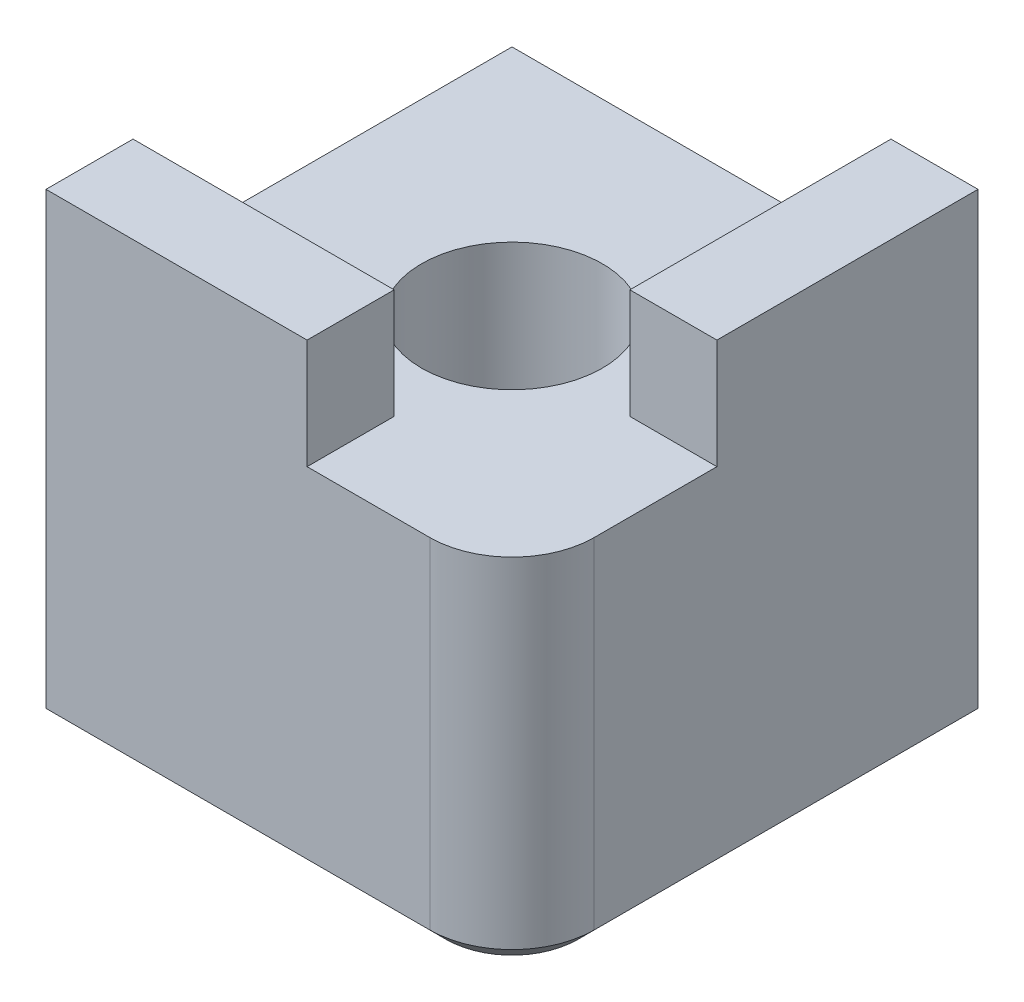
ISO-10303-21;
HEADER;
FILE_DESCRIPTION(('STEP AP214'),'2;1');
FILE_NAME('part.step','',(''),(''),'','','');
FILE_SCHEMA(('AUTOMOTIVE_DESIGN { 1 0 10303 214 1 1 1 1 }'));
ENDSEC;
DATA;
#1=APPLICATION_CONTEXT('core data for automotive mechanical design processes');
#2=APPLICATION_PROTOCOL_DEFINITION('international standard','automotive_design',2000,#1);
#3=PRODUCT_CONTEXT('',#1,'mechanical');
#4=PRODUCT('Part','Part','',(#3));
#5=PRODUCT_RELATED_PRODUCT_CATEGORY('part','',(#4));
#6=PRODUCT_DEFINITION_FORMATION('','',#4);
#7=PRODUCT_DEFINITION_CONTEXT('part definition',#1,'design');
#8=PRODUCT_DEFINITION('design','',#6,#7);
#9=PRODUCT_DEFINITION_SHAPE('','',#8);
#10=(LENGTH_UNIT() NAMED_UNIT(*) SI_UNIT(.MILLI.,.METRE.));
#11=(NAMED_UNIT(*) PLANE_ANGLE_UNIT() SI_UNIT($,.RADIAN.));
#12=(NAMED_UNIT(*) SI_UNIT($,.STERADIAN.) SOLID_ANGLE_UNIT());
#13=UNCERTAINTY_MEASURE_WITH_UNIT(LENGTH_MEASURE(1.E-05),#10,'distance_accuracy_value','');
#14=(GEOMETRIC_REPRESENTATION_CONTEXT(3) GLOBAL_UNCERTAINTY_ASSIGNED_CONTEXT((#13)) GLOBAL_UNIT_ASSIGNED_CONTEXT((#10,
#11,#12)) REPRESENTATION_CONTEXT('',''));
#15=CARTESIAN_POINT('',(0.,0.,0.));
#16=DIRECTION('',(0.,0.,1.));
#17=DIRECTION('',(1.,0.,0.));
#18=AXIS2_PLACEMENT_3D('',#15,#16,#17);
#19=CARTESIAN_POINT('',(0.,-1.5,0.));
#20=DIRECTION('',(0.,1.,0.));
#21=DIRECTION('',(0.,0.,1.));
#22=AXIS2_PLACEMENT_3D('',#19,#20,#21);
#23=PLANE('',#22);
#24=CARTESIAN_POINT('',(0.,-1.5,0.));
#25=DIRECTION('',(0.,1.,0.));
#26=DIRECTION('',(0.,0.,1.));
#27=AXIS2_PLACEMENT_3D('',#24,#25,#26);
#28=CIRCLE('',#27,1.65);
#29=CARTESIAN_POINT('',(0.,-1.5,1.65));
#30=VERTEX_POINT('',#29);
#31=EDGE_CURVE('E252',#30,#30,#28,.T.);
#32=ORIENTED_EDGE('',*,*,#31,.F.);
#33=EDGE_LOOP('',(#32));
#34=FACE_BOUND('',#33,.T.);
#35=DIRECTION('',(-1.,0.,0.));
#36=VECTOR('',#35,1.);
#37=CARTESIAN_POINT('',(-4.25,-1.5,2.6625));
#38=LINE('',#37,#36);
#39=CARTESIAN_POINT('',(0.512500000000001,-1.5,2.6625));
#40=VERTEX_POINT('',#39);
#41=CARTESIAN_POINT('',(-4.25,-1.5,2.6625));
#42=VERTEX_POINT('',#41);
#43=EDGE_CURVE('E197',#40,#42,#38,.T.);
#44=ORIENTED_EDGE('',*,*,#43,.F.);
#45=DIRECTION('',(0.,0.,-1.));
#46=VECTOR('',#45,1.);
#47=CARTESIAN_POINT('',(0.512500000000001,-1.5,4.25));
#48=LINE('',#47,#46);
#49=CARTESIAN_POINT('',(0.512500000000001,-1.5,4.25));
#50=VERTEX_POINT('',#49);
#51=EDGE_CURVE('E202',#50,#40,#48,.T.);
#52=ORIENTED_EDGE('',*,*,#51,.F.);
#53=DIRECTION('',(1.,0.,0.));
#54=VECTOR('',#53,1.);
#55=CARTESIAN_POINT('',(-4.25,-1.5,4.25));
#56=LINE('',#55,#54);
#57=CARTESIAN_POINT('',(2.75,-1.5,4.25));
#58=VERTEX_POINT('',#57);
#59=EDGE_CURVE('E260',#50,#58,#56,.T.);
#60=ORIENTED_EDGE('',*,*,#59,.T.);
#61=CARTESIAN_POINT('',(2.75,-1.5,2.75));
#62=DIRECTION('',(0.,1.,0.));
#63=DIRECTION('',(0.,0.,1.));
#64=AXIS2_PLACEMENT_3D('',#61,#62,#63);
#65=CIRCLE('',#64,1.5);
#66=CARTESIAN_POINT('',(4.25,-1.5,2.75));
#67=VERTEX_POINT('',#66);
#68=EDGE_CURVE('E247',#67,#58,#65,.F.);
#69=ORIENTED_EDGE('',*,*,#68,.F.);
#70=DIRECTION('',(0.,0.,1.));
#71=VECTOR('',#70,1.);
#72=CARTESIAN_POINT('',(4.25,-1.5,-4.25));
#73=LINE('',#72,#71);
#74=CARTESIAN_POINT('',(4.25,-1.5,0.512500000000001));
#75=VERTEX_POINT('',#74);
#76=EDGE_CURVE('E263',#75,#67,#73,.T.);
#77=ORIENTED_EDGE('',*,*,#76,.F.);
#78=DIRECTION('',(1.,0.,0.));
#79=VECTOR('',#78,1.);
#80=CARTESIAN_POINT('',(4.25,-1.5,0.512500000000001));
#81=LINE('',#80,#79);
#82=CARTESIAN_POINT('',(2.6625,-1.5,0.512500000000001));
#83=VERTEX_POINT('',#82);
#84=EDGE_CURVE('E222',#83,#75,#81,.T.);
#85=ORIENTED_EDGE('',*,*,#84,.F.);
#86=DIRECTION('',(0.,0.,1.));
#87=VECTOR('',#86,1.);
#88=CARTESIAN_POINT('',(2.6625,-1.5,-4.25));
#89=LINE('',#88,#87);
#90=CARTESIAN_POINT('',(2.6625,-1.5,-4.25));
#91=VERTEX_POINT('',#90);
#92=EDGE_CURVE('E73',#91,#83,#89,.T.);
#93=ORIENTED_EDGE('',*,*,#92,.F.);
#94=DIRECTION('',(-1.,0.,0.));
#95=VECTOR('',#94,1.);
#96=CARTESIAN_POINT('',(-4.25,-1.5,-4.25));
#97=LINE('',#96,#95);
#98=CARTESIAN_POINT('',(-4.25,-1.5,-4.25));
#99=VERTEX_POINT('',#98);
#100=EDGE_CURVE('E270',#91,#99,#97,.T.);
#101=ORIENTED_EDGE('',*,*,#100,.T.);
#102=DIRECTION('',(0.,0.,1.));
#103=VECTOR('',#102,1.);
#104=CARTESIAN_POINT('',(-4.25,-1.5,-4.25));
#105=LINE('',#104,#103);
#106=EDGE_CURVE('E266',#99,#42,#105,.T.);
#107=ORIENTED_EDGE('',*,*,#106,.T.);
#108=EDGE_LOOP('',(#44,#52,#60,#69,#77,#85,#93,#101,#107));
#109=FACE_BOUND('',#108,.T.);
#110=ADVANCED_FACE('F42',(#34,#109),#23,.T.);
#111=CARTESIAN_POINT('',(-4.25,-8.,4.25));
#112=DIRECTION('',(0.,0.,1.));
#113=DIRECTION('',(1.,0.,0.));
#114=AXIS2_PLACEMENT_3D('',#111,#112,#113);
#115=PLANE('',#114);
#116=DIRECTION('',(0.,1.,0.));
#117=VECTOR('',#116,1.);
#118=CARTESIAN_POINT('',(2.75,-8.,4.25));
#119=LINE('',#118,#117);
#120=CARTESIAN_POINT('',(2.75,-7.7,4.25));
#121=VERTEX_POINT('',#120);
#122=EDGE_CURVE('E179',#121,#58,#119,.T.);
#123=ORIENTED_EDGE('',*,*,#122,.T.);
#124=ORIENTED_EDGE('',*,*,#59,.F.);
#125=DIRECTION('',(0.,-1.,0.));
#126=VECTOR('',#125,1.);
#127=CARTESIAN_POINT('',(0.512500000000001,0.5,4.25));
#128=LINE('',#127,#126);
#129=CARTESIAN_POINT('',(0.512500000000001,0.5,4.25));
#130=VERTEX_POINT('',#129);
#131=EDGE_CURVE('E187',#130,#50,#128,.T.);
#132=ORIENTED_EDGE('',*,*,#131,.F.);
#133=DIRECTION('',(1.,0.,0.));
#134=VECTOR('',#133,1.);
#135=CARTESIAN_POINT('',(-4.25,0.5,4.25));
#136=LINE('',#135,#134);
#137=CARTESIAN_POINT('',(-4.25,0.5,4.25));
#138=VERTEX_POINT('',#137);
#139=EDGE_CURVE('E183',#138,#130,#136,.T.);
#140=ORIENTED_EDGE('',*,*,#139,.F.);
#141=DIRECTION('',(0.,1.,0.));
#142=VECTOR('',#141,1.);
#143=CARTESIAN_POINT('',(-4.25,-8.,4.25));
#144=LINE('',#143,#142);
#145=CARTESIAN_POINT('',(-4.25,-7.7,4.25));
#146=VERTEX_POINT('',#145);
#147=EDGE_CURVE('E168',#146,#138,#144,.T.);
#148=ORIENTED_EDGE('',*,*,#147,.F.);
#149=DIRECTION('',(1.,0.,0.));
#150=VECTOR('',#149,1.);
#151=CARTESIAN_POINT('',(-4.25,-7.7,4.25));
#152=LINE('',#151,#150);
#153=EDGE_CURVE('E302',#146,#121,#152,.T.);
#154=ORIENTED_EDGE('',*,*,#153,.T.);
#155=EDGE_LOOP('',(#123,#124,#132,#140,#148,#154));
#156=FACE_BOUND('',#155,.T.);
#157=ADVANCED_FACE('F185',(#156),#115,.T.);
#158=CARTESIAN_POINT('',(4.25,-8.,4.25));
#159=DIRECTION('',(1.,0.,0.));
#160=DIRECTION('',(0.,0.,-1.));
#161=AXIS2_PLACEMENT_3D('',#158,#159,#160);
#162=PLANE('',#161);
#163=DIRECTION('',(0.,1.,0.));
#164=VECTOR('',#163,1.);
#165=CARTESIAN_POINT('',(4.25,-8.,-4.25));
#166=LINE('',#165,#164);
#167=CARTESIAN_POINT('',(4.25,-7.7,-4.25));
#168=VERTEX_POINT('',#167);
#169=CARTESIAN_POINT('',(4.25,0.5,-4.25));
#170=VERTEX_POINT('',#169);
#171=EDGE_CURVE('E272',#168,#170,#166,.T.);
#172=ORIENTED_EDGE('',*,*,#171,.T.);
#173=DIRECTION('',(0.,0.,-1.));
#174=VECTOR('',#173,1.);
#175=CARTESIAN_POINT('',(4.25,0.5,-4.25));
#176=LINE('',#175,#174);
#177=CARTESIAN_POINT('',(4.25,0.5,0.512500000000001));
#178=VERTEX_POINT('',#177);
#179=EDGE_CURVE('E217',#178,#170,#176,.T.);
#180=ORIENTED_EDGE('',*,*,#179,.F.);
#181=DIRECTION('',(0.,-1.,0.));
#182=VECTOR('',#181,1.);
#183=CARTESIAN_POINT('',(4.25,0.5,0.512500000000001));
#184=LINE('',#183,#182);
#185=EDGE_CURVE('E231',#178,#75,#184,.T.);
#186=ORIENTED_EDGE('',*,*,#185,.T.);
#187=ORIENTED_EDGE('',*,*,#76,.T.);
#188=DIRECTION('',(0.,1.,0.));
#189=VECTOR('',#188,1.);
#190=CARTESIAN_POINT('',(4.25,-8.,2.75));
#191=LINE('',#190,#189);
#192=CARTESIAN_POINT('',(4.25,-7.7,2.75));
#193=VERTEX_POINT('',#192);
#194=EDGE_CURVE('E281',#67,#193,#191,.F.);
#195=ORIENTED_EDGE('',*,*,#194,.T.);
#196=DIRECTION('',(0.,0.,-1.));
#197=VECTOR('',#196,1.);
#198=CARTESIAN_POINT('',(4.25,-7.7,4.25));
#199=LINE('',#198,#197);
#200=EDGE_CURVE('E52',#193,#168,#199,.T.);
#201=ORIENTED_EDGE('',*,*,#200,.T.);
#202=EDGE_LOOP('',(#172,#180,#186,#187,#195,#201));
#203=FACE_BOUND('',#202,.T.);
#204=ADVANCED_FACE('F338',(#203),#162,.T.);
#205=CARTESIAN_POINT('',(2.75,-8.,2.75));
#206=DIRECTION('',(0.,1.,0.));
#207=DIRECTION('',(0.,0.,1.));
#208=AXIS2_PLACEMENT_3D('',#205,#206,#207);
#209=CYLINDRICAL_SURFACE('',#208,1.5);
#210=ORIENTED_EDGE('',*,*,#194,.F.);
#211=ORIENTED_EDGE('',*,*,#68,.T.);
#212=ORIENTED_EDGE('',*,*,#122,.F.);
#213=CARTESIAN_POINT('',(2.75,-7.7,2.75));
#214=DIRECTION('',(0.,-1.,0.));
#215=DIRECTION('',(0.,0.,-1.));
#216=AXIS2_PLACEMENT_3D('',#213,#214,#215);
#217=CIRCLE('',#216,1.5);
#218=EDGE_CURVE('E305',#121,#193,#217,.F.);
#219=ORIENTED_EDGE('',*,*,#218,.T.);
#220=EDGE_LOOP('',(#210,#211,#212,#219));
#221=FACE_BOUND('',#220,.T.);
#222=ADVANCED_FACE('F385',(#221),#209,.T.);
#223=CARTESIAN_POINT('',(-4.25,-8.,4.25));
#224=DIRECTION('',(-1.,0.,0.));
#225=DIRECTION('',(0.,0.,1.));
#226=AXIS2_PLACEMENT_3D('',#223,#224,#225);
#227=PLANE('',#226);
#228=DIRECTION('',(0.,1.,0.));
#229=VECTOR('',#228,1.);
#230=CARTESIAN_POINT('',(-4.25,-8.,-4.25));
#231=LINE('',#230,#229);
#232=CARTESIAN_POINT('',(-4.25,-7.7,-4.25));
#233=VERTEX_POINT('',#232);
#234=EDGE_CURVE('E180',#233,#99,#231,.T.);
#235=ORIENTED_EDGE('',*,*,#234,.F.);
#236=DIRECTION('',(0.,0.,1.));
#237=VECTOR('',#236,1.);
#238=CARTESIAN_POINT('',(-4.25,-7.7,4.25));
#239=LINE('',#238,#237);
#240=EDGE_CURVE('E176',#233,#146,#239,.T.);
#241=ORIENTED_EDGE('',*,*,#240,.T.);
#242=ORIENTED_EDGE('',*,*,#147,.T.);
#243=DIRECTION('',(0.,0.,1.));
#244=VECTOR('',#243,1.);
#245=CARTESIAN_POINT('',(-4.25,0.5,4.25));
#246=LINE('',#245,#244);
#247=CARTESIAN_POINT('',(-4.25,0.5,2.6625));
#248=VERTEX_POINT('',#247);
#249=EDGE_CURVE('E174',#248,#138,#246,.T.);
#250=ORIENTED_EDGE('',*,*,#249,.F.);
#251=DIRECTION('',(0.,-1.,0.));
#252=VECTOR('',#251,1.);
#253=CARTESIAN_POINT('',(-4.25,0.5,2.6625));
#254=LINE('',#253,#252);
#255=EDGE_CURVE('E208',#248,#42,#254,.T.);
#256=ORIENTED_EDGE('',*,*,#255,.T.);
#257=ORIENTED_EDGE('',*,*,#106,.F.);
#258=EDGE_LOOP('',(#235,#241,#242,#250,#256,#257));
#259=FACE_BOUND('',#258,.T.);
#260=ADVANCED_FACE('F171',(#259),#227,.T.);
#261=CARTESIAN_POINT('',(-4.25,-8.,-4.25));
#262=DIRECTION('',(0.,0.,-1.));
#263=DIRECTION('',(-1.,0.,0.));
#264=AXIS2_PLACEMENT_3D('',#261,#262,#263);
#265=PLANE('',#264);
#266=ORIENTED_EDGE('',*,*,#171,.F.);
#267=DIRECTION('',(-1.,0.,0.));
#268=VECTOR('',#267,1.);
#269=CARTESIAN_POINT('',(-4.25,-7.7,-4.25));
#270=LINE('',#269,#268);
#271=EDGE_CURVE('E11',#168,#233,#270,.T.);
#272=ORIENTED_EDGE('',*,*,#271,.T.);
#273=ORIENTED_EDGE('',*,*,#234,.T.);
#274=ORIENTED_EDGE('',*,*,#100,.F.);
#275=DIRECTION('',(0.,-1.,0.));
#276=VECTOR('',#275,1.);
#277=CARTESIAN_POINT('',(2.6625,0.5,-4.25));
#278=LINE('',#277,#276);
#279=CARTESIAN_POINT('',(2.6625,0.5,-4.25));
#280=VERTEX_POINT('',#279);
#281=EDGE_CURVE('E244',#280,#91,#278,.T.);
#282=ORIENTED_EDGE('',*,*,#281,.F.);
#283=DIRECTION('',(-1.,0.,0.));
#284=VECTOR('',#283,1.);
#285=CARTESIAN_POINT('',(4.25,0.5,-4.25));
#286=LINE('',#285,#284);
#287=EDGE_CURVE('E221',#170,#280,#286,.T.);
#288=ORIENTED_EDGE('',*,*,#287,.F.);
#289=EDGE_LOOP('',(#266,#272,#273,#274,#282,#288));
#290=FACE_BOUND('',#289,.T.);
#291=ADVANCED_FACE('F343',(#290),#265,.T.);
#292=CARTESIAN_POINT('',(0.,-8.,0.));
#293=DIRECTION('',(0.,-1.,0.));
#294=DIRECTION('',(0.,0.,-1.));
#295=AXIS2_PLACEMENT_3D('',#292,#293,#294);
#296=PLANE('',#295);
#297=DIRECTION('',(-1.,0.,0.));
#298=VECTOR('',#297,1.);
#299=CARTESIAN_POINT('',(0.,-8.,3.95));
#300=LINE('',#299,#298);
#301=CARTESIAN_POINT('',(2.75,-8.,3.95));
#302=VERTEX_POINT('',#301);
#303=CARTESIAN_POINT('',(-3.95,-8.,3.95));
#304=VERTEX_POINT('',#303);
#305=EDGE_CURVE('E295',#302,#304,#300,.T.);
#306=ORIENTED_EDGE('',*,*,#305,.T.);
#307=DIRECTION('',(0.,0.,-1.));
#308=VECTOR('',#307,1.);
#309=CARTESIAN_POINT('',(-3.95,-8.,0.));
#310=LINE('',#309,#308);
#311=CARTESIAN_POINT('',(-3.95,-8.,-3.95));
#312=VERTEX_POINT('',#311);
#313=EDGE_CURVE('E298',#304,#312,#310,.T.);
#314=ORIENTED_EDGE('',*,*,#313,.T.);
#315=DIRECTION('',(1.,0.,0.));
#316=VECTOR('',#315,1.);
#317=CARTESIAN_POINT('',(0.,-8.,-3.95));
#318=LINE('',#317,#316);
#319=CARTESIAN_POINT('',(3.95,-8.,-3.95));
#320=VERTEX_POINT('',#319);
#321=EDGE_CURVE('E286',#312,#320,#318,.T.);
#322=ORIENTED_EDGE('',*,*,#321,.T.);
#323=DIRECTION('',(0.,0.,1.));
#324=VECTOR('',#323,1.);
#325=CARTESIAN_POINT('',(3.95,-8.,0.));
#326=LINE('',#325,#324);
#327=CARTESIAN_POINT('',(3.95,-8.,2.75));
#328=VERTEX_POINT('',#327);
#329=EDGE_CURVE('E289',#320,#328,#326,.T.);
#330=ORIENTED_EDGE('',*,*,#329,.T.);
#331=CARTESIAN_POINT('',(2.75,-8.,2.75));
#332=DIRECTION('',(0.,-1.,0.));
#333=DIRECTION('',(0.,0.,-1.));
#334=AXIS2_PLACEMENT_3D('',#331,#332,#333);
#335=CIRCLE('',#334,1.2);
#336=EDGE_CURVE('E292',#328,#302,#335,.T.);
#337=ORIENTED_EDGE('',*,*,#336,.T.);
#338=EDGE_LOOP('',(#306,#314,#322,#330,#337));
#339=FACE_BOUND('',#338,.T.);
#340=CARTESIAN_POINT('',(0.,-8.,0.));
#341=DIRECTION('',(0.,1.,0.));
#342=DIRECTION('',(0.,0.,1.));
#343=AXIS2_PLACEMENT_3D('',#340,#341,#342);
#344=CIRCLE('',#343,1.65);
#345=CARTESIAN_POINT('',(0.,-8.,1.65));
#346=VERTEX_POINT('',#345);
#347=EDGE_CURVE('E256',#346,#346,#344,.T.);
#348=ORIENTED_EDGE('',*,*,#347,.T.);
#349=EDGE_LOOP('',(#348));
#350=FACE_BOUND('',#349,.T.);
#351=ADVANCED_FACE('F379',(#339,#350),#296,.T.);
#352=CARTESIAN_POINT('',(0.,-1.5,0.));
#353=DIRECTION('',(0.,1.,0.));
#354=DIRECTION('',(0.,0.,1.));
#355=AXIS2_PLACEMENT_3D('',#352,#353,#354);
#356=CYLINDRICAL_SURFACE('',#355,1.65);
#357=ORIENTED_EDGE('',*,*,#347,.F.);
#358=EDGE_LOOP('',(#357));
#359=FACE_BOUND('',#358,.T.);
#360=ORIENTED_EDGE('',*,*,#31,.T.);
#361=EDGE_LOOP('',(#360));
#362=FACE_BOUND('',#361,.T.);
#363=ADVANCED_FACE('F378',(#359,#362),#356,.F.);
#364=CARTESIAN_POINT('',(4.25,-7.7,4.25));
#365=DIRECTION('',(-0.707106781186543,0.707106781186552,0.));
#366=DIRECTION('',(0.,0.,-1.));
#367=AXIS2_PLACEMENT_3D('',#364,#365,#366);
#368=PLANE('',#367);
#369=DIRECTION('',(-0.577350269189628,-0.577350269189622,0.577350269189628));
#370=VECTOR('',#369,1.);
#371=CARTESIAN_POINT('',(1.41666666666664,-10.5333333333333,-1.41666666666665));
#372=LINE('',#371,#370);
#373=EDGE_CURVE('E319',#168,#320,#372,.T.);
#374=ORIENTED_EDGE('',*,*,#373,.F.);
#375=ORIENTED_EDGE('',*,*,#200,.F.);
#376=DIRECTION('',(0.707106781186552,0.707106781186543,0.));
#377=VECTOR('',#376,1.);
#378=CARTESIAN_POINT('',(3.95,-8.,2.75));
#379=LINE('',#378,#377);
#380=EDGE_CURVE('E46',#328,#193,#379,.T.);
#381=ORIENTED_EDGE('',*,*,#380,.F.);
#382=ORIENTED_EDGE('',*,*,#329,.F.);
#383=EDGE_LOOP('',(#374,#375,#381,#382));
#384=FACE_BOUND('',#383,.T.);
#385=ADVANCED_FACE('F44',(#384),#368,.F.);
#386=CARTESIAN_POINT('',(2.75,-8.,2.75));
#387=DIRECTION('',(0.,1.,0.));
#388=DIRECTION('',(0.,0.,1.));
#389=AXIS2_PLACEMENT_3D('',#386,#387,#388);
#390=CONICAL_SURFACE('',#389,1.2,0.785398163397455);
#391=ORIENTED_EDGE('',*,*,#380,.T.);
#392=ORIENTED_EDGE('',*,*,#218,.F.);
#393=DIRECTION('',(0.,0.707106781186543,0.707106781186552));
#394=VECTOR('',#393,1.);
#395=CARTESIAN_POINT('',(2.75,-8.,3.95));
#396=LINE('',#395,#394);
#397=EDGE_CURVE('E316',#302,#121,#396,.T.);
#398=ORIENTED_EDGE('',*,*,#397,.F.);
#399=ORIENTED_EDGE('',*,*,#336,.F.);
#400=EDGE_LOOP('',(#391,#392,#398,#399));
#401=FACE_BOUND('',#400,.T.);
#402=ADVANCED_FACE('F331',(#401),#390,.T.);
#403=CARTESIAN_POINT('',(-4.25,-7.7,-4.25));
#404=DIRECTION('',(0.,0.707106781186552,0.707106781186543));
#405=DIRECTION('',(-1.,0.,0.));
#406=AXIS2_PLACEMENT_3D('',#403,#404,#405);
#407=PLANE('',#406);
#408=ORIENTED_EDGE('',*,*,#373,.T.);
#409=ORIENTED_EDGE('',*,*,#321,.F.);
#410=DIRECTION('',(-0.577350269189628,0.577350269189622,-0.577350269189628));
#411=VECTOR('',#410,1.);
#412=CARTESIAN_POINT('',(-4.25,-7.7,-4.25));
#413=LINE('',#412,#411);
#414=EDGE_CURVE('E313',#233,#312,#413,.F.);
#415=ORIENTED_EDGE('',*,*,#414,.F.);
#416=ORIENTED_EDGE('',*,*,#271,.F.);
#417=EDGE_LOOP('',(#408,#409,#415,#416));
#418=FACE_BOUND('',#417,.T.);
#419=ADVANCED_FACE('F395',(#418),#407,.F.);
#420=CARTESIAN_POINT('',(-4.25,-7.7,4.25));
#421=DIRECTION('',(0.,0.707106781186552,-0.707106781186543));
#422=DIRECTION('',(1.,0.,0.));
#423=AXIS2_PLACEMENT_3D('',#420,#421,#422);
#424=PLANE('',#423);
#425=ORIENTED_EDGE('',*,*,#397,.T.);
#426=ORIENTED_EDGE('',*,*,#153,.F.);
#427=DIRECTION('',(0.577350269189628,-0.577350269189622,-0.577350269189628));
#428=VECTOR('',#427,1.);
#429=CARTESIAN_POINT('',(-4.25,-7.7,4.25));
#430=LINE('',#429,#428);
#431=EDGE_CURVE('E251',#304,#146,#430,.F.);
#432=ORIENTED_EDGE('',*,*,#431,.F.);
#433=ORIENTED_EDGE('',*,*,#305,.F.);
#434=EDGE_LOOP('',(#425,#426,#432,#433));
#435=FACE_BOUND('',#434,.T.);
#436=ADVANCED_FACE('F365',(#435),#424,.F.);
#437=CARTESIAN_POINT('',(-4.25,-7.7,4.25));
#438=DIRECTION('',(0.707106781186543,0.707106781186552,0.));
#439=DIRECTION('',(0.,0.,1.));
#440=AXIS2_PLACEMENT_3D('',#437,#438,#439);
#441=PLANE('',#440);
#442=ORIENTED_EDGE('',*,*,#414,.T.);
#443=ORIENTED_EDGE('',*,*,#313,.F.);
#444=ORIENTED_EDGE('',*,*,#431,.T.);
#445=ORIENTED_EDGE('',*,*,#240,.F.);
#446=EDGE_LOOP('',(#442,#443,#444,#445));
#447=FACE_BOUND('',#446,.T.);
#448=ADVANCED_FACE('F358',(#447),#441,.F.);
#449=CARTESIAN_POINT('',(2.6625,0.5,-4.25));
#450=DIRECTION('',(1.,0.,0.));
#451=DIRECTION('',(0.,0.,-1.));
#452=AXIS2_PLACEMENT_3D('',#449,#450,#451);
#453=PLANE('',#452);
#454=ORIENTED_EDGE('',*,*,#92,.T.);
#455=DIRECTION('',(0.,-1.,0.));
#456=VECTOR('',#455,1.);
#457=CARTESIAN_POINT('',(2.6625,0.5,0.512500000000001));
#458=LINE('',#457,#456);
#459=CARTESIAN_POINT('',(2.6625,0.5,0.512500000000001));
#460=VERTEX_POINT('',#459);
#461=EDGE_CURVE('E240',#460,#83,#458,.T.);
#462=ORIENTED_EDGE('',*,*,#461,.F.);
#463=DIRECTION('',(0.,0.,1.));
#464=VECTOR('',#463,1.);
#465=CARTESIAN_POINT('',(2.6625,0.5,-4.25));
#466=LINE('',#465,#464);
#467=EDGE_CURVE('E225',#280,#460,#466,.T.);
#468=ORIENTED_EDGE('',*,*,#467,.F.);
#469=ORIENTED_EDGE('',*,*,#281,.T.);
#470=EDGE_LOOP('',(#454,#462,#468,#469));
#471=FACE_BOUND('',#470,.T.);
#472=ADVANCED_FACE('F356',(#471),#453,.F.);
#473=CARTESIAN_POINT('',(4.25,0.5,0.512500000000001));
#474=DIRECTION('',(0.,0.,-1.));
#475=DIRECTION('',(-1.,0.,0.));
#476=AXIS2_PLACEMENT_3D('',#473,#474,#475);
#477=PLANE('',#476);
#478=ORIENTED_EDGE('',*,*,#84,.T.);
#479=ORIENTED_EDGE('',*,*,#185,.F.);
#480=DIRECTION('',(1.,0.,0.));
#481=VECTOR('',#480,1.);
#482=CARTESIAN_POINT('',(4.25,0.5,0.512500000000001));
#483=LINE('',#482,#481);
#484=EDGE_CURVE('E228',#460,#178,#483,.T.);
#485=ORIENTED_EDGE('',*,*,#484,.F.);
#486=ORIENTED_EDGE('',*,*,#461,.T.);
#487=EDGE_LOOP('',(#478,#479,#485,#486));
#488=FACE_BOUND('',#487,.T.);
#489=ADVANCED_FACE('F352',(#488),#477,.F.);
#490=CARTESIAN_POINT('',(0.,0.5,0.));
#491=DIRECTION('',(0.,-1.,0.));
#492=DIRECTION('',(0.,0.,-1.));
#493=AXIS2_PLACEMENT_3D('',#490,#491,#492);
#494=PLANE('',#493);
#495=ORIENTED_EDGE('',*,*,#179,.T.);
#496=ORIENTED_EDGE('',*,*,#287,.T.);
#497=ORIENTED_EDGE('',*,*,#467,.T.);
#498=ORIENTED_EDGE('',*,*,#484,.T.);
#499=EDGE_LOOP('',(#495,#496,#497,#498));
#500=FACE_BOUND('',#499,.T.);
#501=ADVANCED_FACE('F347',(#500),#494,.F.);
#502=CARTESIAN_POINT('',(0.512500000000001,0.5,4.25));
#503=DIRECTION('',(-1.,0.,0.));
#504=DIRECTION('',(0.,0.,1.));
#505=AXIS2_PLACEMENT_3D('',#502,#503,#504);
#506=PLANE('',#505);
#507=ORIENTED_EDGE('',*,*,#51,.T.);
#508=DIRECTION('',(0.,-1.,0.));
#509=VECTOR('',#508,1.);
#510=CARTESIAN_POINT('',(0.512500000000001,0.5,2.6625));
#511=LINE('',#510,#509);
#512=CARTESIAN_POINT('',(0.512500000000001,0.5,2.6625));
#513=VERTEX_POINT('',#512);
#514=EDGE_CURVE('E63',#513,#40,#511,.T.);
#515=ORIENTED_EDGE('',*,*,#514,.F.);
#516=DIRECTION('',(0.,0.,-1.));
#517=VECTOR('',#516,1.);
#518=CARTESIAN_POINT('',(0.512500000000001,0.5,4.25));
#519=LINE('',#518,#517);
#520=EDGE_CURVE('E191',#130,#513,#519,.T.);
#521=ORIENTED_EDGE('',*,*,#520,.F.);
#522=ORIENTED_EDGE('',*,*,#131,.T.);
#523=EDGE_LOOP('',(#507,#515,#521,#522));
#524=FACE_BOUND('',#523,.T.);
#525=ADVANCED_FACE('F452',(#524),#506,.F.);
#526=CARTESIAN_POINT('',(-4.25,0.5,2.6625));
#527=DIRECTION('',(0.,0.,1.));
#528=DIRECTION('',(1.,0.,0.));
#529=AXIS2_PLACEMENT_3D('',#526,#527,#528);
#530=PLANE('',#529);
#531=ORIENTED_EDGE('',*,*,#43,.T.);
#532=ORIENTED_EDGE('',*,*,#255,.F.);
#533=DIRECTION('',(-1.,0.,0.));
#534=VECTOR('',#533,1.);
#535=CARTESIAN_POINT('',(-4.25,0.5,2.6625));
#536=LINE('',#535,#534);
#537=EDGE_CURVE('E194',#513,#248,#536,.T.);
#538=ORIENTED_EDGE('',*,*,#537,.F.);
#539=ORIENTED_EDGE('',*,*,#514,.T.);
#540=EDGE_LOOP('',(#531,#532,#538,#539));
#541=FACE_BOUND('',#540,.T.);
#542=ADVANCED_FACE('F461',(#541),#530,.F.);
#543=CARTESIAN_POINT('',(0.,0.5,0.));
#544=DIRECTION('',(0.,-1.,0.));
#545=DIRECTION('',(0.,0.,-1.));
#546=AXIS2_PLACEMENT_3D('',#543,#544,#545);
#547=PLANE('',#546);
#548=ORIENTED_EDGE('',*,*,#249,.T.);
#549=ORIENTED_EDGE('',*,*,#139,.T.);
#550=ORIENTED_EDGE('',*,*,#520,.T.);
#551=ORIENTED_EDGE('',*,*,#537,.T.);
#552=EDGE_LOOP('',(#548,#549,#550,#551));
#553=FACE_BOUND('',#552,.T.);
#554=ADVANCED_FACE('F193',(#553),#547,.F.);
#555=CLOSED_SHELL('',(#110,#157,#204,#222,#260,#291,#351,#363,#385,#402,#419,#436,#448,#472,
#489,#501,#525,#542,#554));
#556=MANIFOLD_SOLID_BREP('B2',#555);
#557=ADVANCED_BREP_SHAPE_REPRESENTATION('',(#18,#556),#14);
#558=SHAPE_DEFINITION_REPRESENTATION(#9,#557);
ENDSEC;
END-ISO-10303-21;
